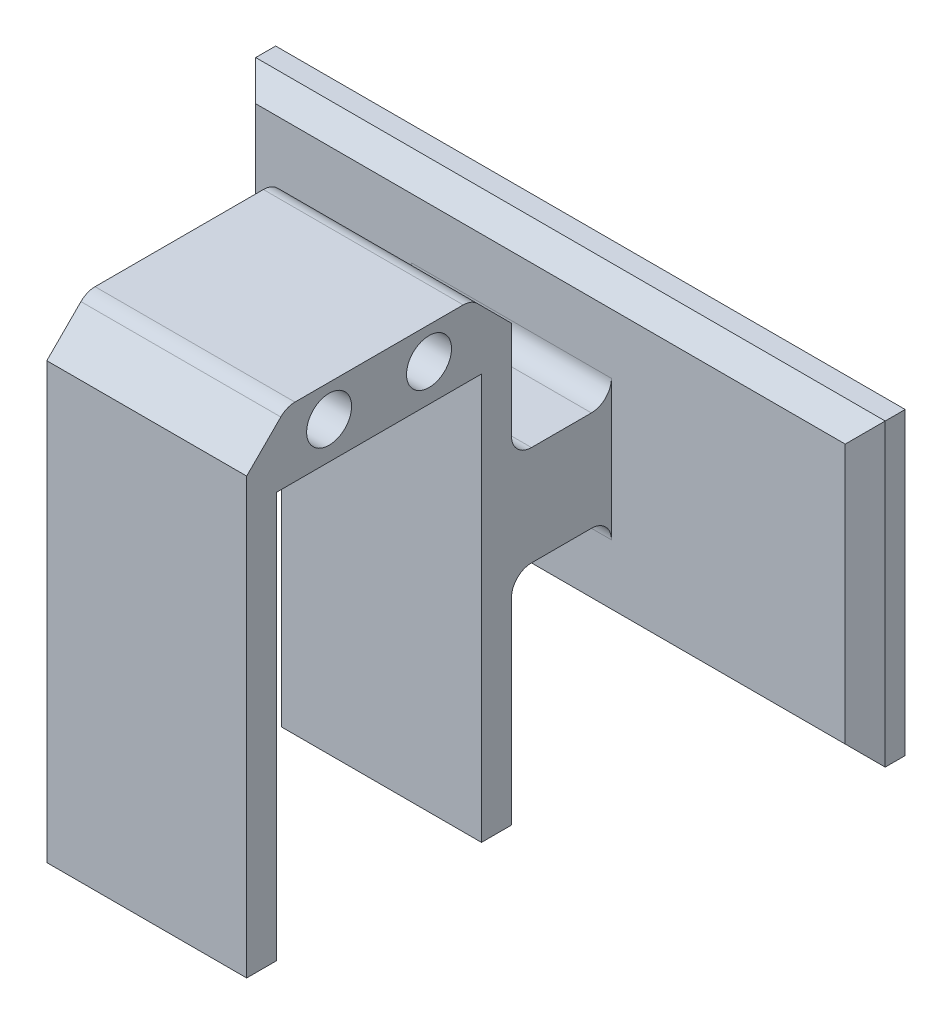
ISO-10303-21;
HEADER;
FILE_DESCRIPTION(('STEP AP214'),'2;1');
FILE_NAME('part.step','',(''),(''),'','','');
FILE_SCHEMA(('AUTOMOTIVE_DESIGN { 1 0 10303 214 1 1 1 1 }'));
ENDSEC;
DATA;
#1=APPLICATION_CONTEXT('core data for automotive mechanical design processes');
#2=APPLICATION_PROTOCOL_DEFINITION('international standard','automotive_design',2000,#1);
#3=PRODUCT_CONTEXT('',#1,'mechanical');
#4=PRODUCT('Part','Part','',(#3));
#5=PRODUCT_RELATED_PRODUCT_CATEGORY('part','',(#4));
#6=PRODUCT_DEFINITION_FORMATION('','',#4);
#7=PRODUCT_DEFINITION_CONTEXT('part definition',#1,'design');
#8=PRODUCT_DEFINITION('design','',#6,#7);
#9=PRODUCT_DEFINITION_SHAPE('','',#8);
#10=(LENGTH_UNIT() NAMED_UNIT(*) SI_UNIT(.MILLI.,.METRE.));
#11=(NAMED_UNIT(*) PLANE_ANGLE_UNIT() SI_UNIT($,.RADIAN.));
#12=(NAMED_UNIT(*) SI_UNIT($,.STERADIAN.) SOLID_ANGLE_UNIT());
#13=UNCERTAINTY_MEASURE_WITH_UNIT(LENGTH_MEASURE(1.E-05),#10,'distance_accuracy_value','');
#14=(GEOMETRIC_REPRESENTATION_CONTEXT(3) GLOBAL_UNCERTAINTY_ASSIGNED_CONTEXT((#13)) GLOBAL_UNIT_ASSIGNED_CONTEXT((#10,
#11,#12)) REPRESENTATION_CONTEXT('',''));
#15=CARTESIAN_POINT('',(0.,0.,0.));
#16=DIRECTION('',(0.,0.,1.));
#17=DIRECTION('',(1.,0.,0.));
#18=AXIS2_PLACEMENT_3D('',#15,#16,#17);
#19=CARTESIAN_POINT('',(20.,0.,-13.25));
#20=DIRECTION('',(0.,0.,1.));
#21=DIRECTION('',(0.,-1.,0.));
#22=AXIS2_PLACEMENT_3D('',#19,#20,#21);
#23=PLANE('',#22);
#24=DIRECTION('',(0.,1.,0.));
#25=VECTOR('',#24,1.);
#26=CARTESIAN_POINT('',(20.,0.,-13.25));
#27=LINE('',#26,#25);
#28=CARTESIAN_POINT('',(20.,13.423218072507,-13.25));
#29=VERTEX_POINT('',#28);
#30=CARTESIAN_POINT('',(20.,23.2,-13.25));
#31=VERTEX_POINT('',#30);
#32=EDGE_CURVE('E281',#29,#31,#27,.T.);
#33=ORIENTED_EDGE('',*,*,#32,.F.);
#34=DIRECTION('',(1.,0.,0.));
#35=VECTOR('',#34,1.);
#36=CARTESIAN_POINT('',(20.,13.423218072507,-13.25));
#37=LINE('',#36,#35);
#38=CARTESIAN_POINT('',(0.,13.423218072507,-13.25));
#39=VERTEX_POINT('',#38);
#40=EDGE_CURVE('E368',#29,#39,#37,.F.);
#41=ORIENTED_EDGE('',*,*,#40,.T.);
#42=DIRECTION('',(0.,1.,0.));
#43=VECTOR('',#42,1.);
#44=CARTESIAN_POINT('',(0.,0.,-13.25));
#45=LINE('',#44,#43);
#46=CARTESIAN_POINT('',(0.,23.2,-13.25));
#47=VERTEX_POINT('',#46);
#48=EDGE_CURVE('E301',#39,#47,#45,.T.);
#49=ORIENTED_EDGE('',*,*,#48,.T.);
#50=DIRECTION('',(1.,0.,0.));
#51=VECTOR('',#50,1.);
#52=CARTESIAN_POINT('',(20.,23.2,-13.25));
#53=LINE('',#52,#51);
#54=EDGE_CURVE('E331',#47,#31,#53,.T.);
#55=ORIENTED_EDGE('',*,*,#54,.T.);
#56=EDGE_LOOP('',(#33,#41,#49,#55));
#57=FACE_BOUND('',#56,.T.);
#58=ADVANCED_FACE('F42',(#57),#23,.F.);
#59=CARTESIAN_POINT('',(20.,24.,4.99999999999999));
#60=DIRECTION('',(-1.,0.,0.));
#61=DIRECTION('',(0.,0.,1.));
#62=AXIS2_PLACEMENT_3D('',#59,#60,#61);
#63=CYLINDRICAL_SURFACE('',#62,2.25);
#64=CARTESIAN_POINT('',(20.,24.,4.99999999999999));
#65=DIRECTION('',(1.,0.,0.));
#66=DIRECTION('',(0.,0.,-1.));
#67=AXIS2_PLACEMENT_3D('',#64,#65,#66);
#68=CIRCLE('',#67,2.25);
#69=CARTESIAN_POINT('',(20.,24.,2.74999999999999));
#70=VERTEX_POINT('',#69);
#71=EDGE_CURVE('E274',#70,#70,#68,.T.);
#72=ORIENTED_EDGE('',*,*,#71,.T.);
#73=EDGE_LOOP('',(#72));
#74=FACE_BOUND('',#73,.T.);
#75=CARTESIAN_POINT('',(10.,24.,4.99999999999999));
#76=DIRECTION('',(-1.,0.,0.));
#77=DIRECTION('',(0.,0.,1.));
#78=AXIS2_PLACEMENT_3D('',#75,#76,#77);
#79=CIRCLE('',#78,2.25);
#80=CARTESIAN_POINT('',(10.,24.,7.24999999999999));
#81=VERTEX_POINT('',#80);
#82=EDGE_CURVE('E262',#81,#81,#79,.T.);
#83=ORIENTED_EDGE('',*,*,#82,.T.);
#84=EDGE_LOOP('',(#83));
#85=FACE_BOUND('',#84,.T.);
#86=ADVANCED_FACE('F520',(#74,#85),#63,.F.);
#87=CARTESIAN_POINT('',(20.,24.,-5.00000000000001));
#88=DIRECTION('',(-1.,0.,0.));
#89=DIRECTION('',(0.,0.,1.));
#90=AXIS2_PLACEMENT_3D('',#87,#88,#89);
#91=CYLINDRICAL_SURFACE('',#90,2.25);
#92=CARTESIAN_POINT('',(20.,24.,-5.00000000000001));
#93=DIRECTION('',(1.,0.,0.));
#94=DIRECTION('',(0.,0.,-1.));
#95=AXIS2_PLACEMENT_3D('',#92,#93,#94);
#96=CIRCLE('',#95,2.25);
#97=CARTESIAN_POINT('',(20.,24.,-7.25000000000002));
#98=VERTEX_POINT('',#97);
#99=EDGE_CURVE('E271',#98,#98,#96,.T.);
#100=ORIENTED_EDGE('',*,*,#99,.T.);
#101=EDGE_LOOP('',(#100));
#102=FACE_BOUND('',#101,.T.);
#103=CARTESIAN_POINT('',(10.,24.,-5.00000000000001));
#104=DIRECTION('',(-1.,0.,0.));
#105=DIRECTION('',(0.,0.,1.));
#106=AXIS2_PLACEMENT_3D('',#103,#104,#105);
#107=CIRCLE('',#106,2.25);
#108=CARTESIAN_POINT('',(10.,24.,-2.75000000000001));
#109=VERTEX_POINT('',#108);
#110=EDGE_CURVE('E267',#109,#109,#107,.T.);
#111=ORIENTED_EDGE('',*,*,#110,.T.);
#112=EDGE_LOOP('',(#111));
#113=FACE_BOUND('',#112,.T.);
#114=ADVANCED_FACE('F525',(#102,#113),#91,.F.);
#115=CARTESIAN_POINT('',(20.,-20.3,0.));
#116=DIRECTION('',(0.,1.,0.));
#117=DIRECTION('',(0.,0.,1.));
#118=AXIS2_PLACEMENT_3D('',#115,#116,#117);
#119=PLANE('',#118);
#120=DIRECTION('',(0.,0.,-1.));
#121=VECTOR('',#120,1.);
#122=CARTESIAN_POINT('',(0.,-20.3,0.));
#123=LINE('',#122,#121);
#124=CARTESIAN_POINT('',(0.,-20.3,-10.25));
#125=VERTEX_POINT('',#124);
#126=CARTESIAN_POINT('',(0.,-20.3,-13.25));
#127=VERTEX_POINT('',#126);
#128=EDGE_CURVE('E270',#125,#127,#123,.T.);
#129=ORIENTED_EDGE('',*,*,#128,.T.);
#130=DIRECTION('',(-1.,0.,0.));
#131=VECTOR('',#130,1.);
#132=CARTESIAN_POINT('',(20.,-20.3,-13.25));
#133=LINE('',#132,#131);
#134=CARTESIAN_POINT('',(20.,-20.3,-13.25));
#135=VERTEX_POINT('',#134);
#136=EDGE_CURVE('E328',#135,#127,#133,.T.);
#137=ORIENTED_EDGE('',*,*,#136,.F.);
#138=DIRECTION('',(0.,0.,-1.));
#139=VECTOR('',#138,1.);
#140=CARTESIAN_POINT('',(20.,-20.3,0.));
#141=LINE('',#140,#139);
#142=CARTESIAN_POINT('',(20.,-20.3,-10.25));
#143=VERTEX_POINT('',#142);
#144=EDGE_CURVE('E278',#143,#135,#141,.T.);
#145=ORIENTED_EDGE('',*,*,#144,.F.);
#146=DIRECTION('',(-1.,0.,0.));
#147=VECTOR('',#146,1.);
#148=CARTESIAN_POINT('',(20.,-20.3,-10.25));
#149=LINE('',#148,#147);
#150=EDGE_CURVE('E298',#143,#125,#149,.T.);
#151=ORIENTED_EDGE('',*,*,#150,.T.);
#152=EDGE_LOOP('',(#129,#137,#145,#151));
#153=FACE_BOUND('',#152,.T.);
#154=ADVANCED_FACE('F499',(#153),#119,.F.);
#155=CARTESIAN_POINT('',(0.,-0.57678192749301,-13.25));
#156=VERTEX_POINT('',#155);
#157=EDGE_CURVE('E302',#127,#156,#45,.T.);
#158=ORIENTED_EDGE('',*,*,#157,.T.);
#159=DIRECTION('',(1.,0.,0.));
#160=VECTOR('',#159,1.);
#161=CARTESIAN_POINT('',(20.,-0.57678192749301,-13.25));
#162=LINE('',#161,#160);
#163=CARTESIAN_POINT('',(20.,-0.57678192749301,-13.25));
#164=VERTEX_POINT('',#163);
#165=EDGE_CURVE('E370',#156,#164,#162,.T.);
#166=ORIENTED_EDGE('',*,*,#165,.T.);
#167=EDGE_CURVE('E282',#135,#164,#27,.T.);
#168=ORIENTED_EDGE('',*,*,#167,.F.);
#169=ORIENTED_EDGE('',*,*,#136,.T.);
#170=EDGE_LOOP('',(#158,#166,#168,#169));
#171=FACE_BOUND('',#170,.T.);
#172=ADVANCED_FACE('F502',(#171),#23,.F.);
#173=CARTESIAN_POINT('',(20.,0.,13.25));
#174=DIRECTION('',(0.,0.,1.));
#175=DIRECTION('',(1.,0.,0.));
#176=AXIS2_PLACEMENT_3D('',#173,#174,#175);
#177=PLANE('',#176);
#178=DIRECTION('',(0.,1.,0.));
#179=VECTOR('',#178,1.);
#180=CARTESIAN_POINT('',(20.,0.,13.25));
#181=LINE('',#180,#179);
#182=CARTESIAN_POINT('',(20.,-20.3,13.25));
#183=VERTEX_POINT('',#182);
#184=CARTESIAN_POINT('',(20.,23.2,13.25));
#185=VERTEX_POINT('',#184);
#186=EDGE_CURVE('E285',#183,#185,#181,.T.);
#187=ORIENTED_EDGE('',*,*,#186,.T.);
#188=DIRECTION('',(-1.,0.,0.));
#189=VECTOR('',#188,1.);
#190=CARTESIAN_POINT('',(0.,23.2,13.25));
#191=LINE('',#190,#189);
#192=CARTESIAN_POINT('',(0.,23.2,13.25));
#193=VERTEX_POINT('',#192);
#194=EDGE_CURVE('E342',#185,#193,#191,.T.);
#195=ORIENTED_EDGE('',*,*,#194,.T.);
#196=DIRECTION('',(0.,1.,0.));
#197=VECTOR('',#196,1.);
#198=CARTESIAN_POINT('',(0.,0.,13.25));
#199=LINE('',#198,#197);
#200=CARTESIAN_POINT('',(0.,-20.3,13.25));
#201=VERTEX_POINT('',#200);
#202=EDGE_CURVE('E305',#201,#193,#199,.T.);
#203=ORIENTED_EDGE('',*,*,#202,.F.);
#204=DIRECTION('',(-1.,0.,0.));
#205=VECTOR('',#204,1.);
#206=CARTESIAN_POINT('',(20.,-20.3,13.25));
#207=LINE('',#206,#205);
#208=EDGE_CURVE('E326',#183,#201,#207,.T.);
#209=ORIENTED_EDGE('',*,*,#208,.F.);
#210=EDGE_LOOP('',(#187,#195,#203,#209));
#211=FACE_BOUND('',#210,.T.);
#212=ADVANCED_FACE('F477',(#211),#177,.T.);
#213=CARTESIAN_POINT('',(20.,-20.3,0.));
#214=DIRECTION('',(0.,-1.,0.));
#215=DIRECTION('',(0.,0.,-1.));
#216=AXIS2_PLACEMENT_3D('',#213,#214,#215);
#217=PLANE('',#216);
#218=DIRECTION('',(0.,0.,1.));
#219=VECTOR('',#218,1.);
#220=CARTESIAN_POINT('',(0.,-20.3,0.));
#221=LINE('',#220,#219);
#222=CARTESIAN_POINT('',(0.,-20.3,10.25));
#223=VERTEX_POINT('',#222);
#224=EDGE_CURVE('E308',#223,#201,#221,.T.);
#225=ORIENTED_EDGE('',*,*,#224,.F.);
#226=DIRECTION('',(-1.,0.,0.));
#227=VECTOR('',#226,1.);
#228=CARTESIAN_POINT('',(20.,-20.3,10.25));
#229=LINE('',#228,#227);
#230=CARTESIAN_POINT('',(20.,-20.3,10.25));
#231=VERTEX_POINT('',#230);
#232=EDGE_CURVE('E324',#231,#223,#229,.T.);
#233=ORIENTED_EDGE('',*,*,#232,.F.);
#234=DIRECTION('',(0.,0.,1.));
#235=VECTOR('',#234,1.);
#236=CARTESIAN_POINT('',(20.,-20.3,0.));
#237=LINE('',#236,#235);
#238=EDGE_CURVE('E288',#231,#183,#237,.T.);
#239=ORIENTED_EDGE('',*,*,#238,.T.);
#240=ORIENTED_EDGE('',*,*,#208,.T.);
#241=EDGE_LOOP('',(#225,#233,#239,#240));
#242=FACE_BOUND('',#241,.T.);
#243=ADVANCED_FACE('F482',(#242),#217,.T.);
#244=CARTESIAN_POINT('',(20.,0.,10.25));
#245=DIRECTION('',(0.,0.,1.));
#246=DIRECTION('',(1.,0.,0.));
#247=AXIS2_PLACEMENT_3D('',#244,#245,#246);
#248=PLANE('',#247);
#249=DIRECTION('',(0.,1.,0.));
#250=VECTOR('',#249,1.);
#251=CARTESIAN_POINT('',(0.,0.,10.25));
#252=LINE('',#251,#250);
#253=CARTESIAN_POINT('',(0.,20.3,10.25));
#254=VERTEX_POINT('',#253);
#255=EDGE_CURVE('E311',#223,#254,#252,.T.);
#256=ORIENTED_EDGE('',*,*,#255,.T.);
#257=DIRECTION('',(-1.,0.,0.));
#258=VECTOR('',#257,1.);
#259=CARTESIAN_POINT('',(20.,20.3,10.25));
#260=LINE('',#259,#258);
#261=CARTESIAN_POINT('',(20.,20.3,10.25));
#262=VERTEX_POINT('',#261);
#263=EDGE_CURVE('E321',#262,#254,#260,.T.);
#264=ORIENTED_EDGE('',*,*,#263,.F.);
#265=DIRECTION('',(0.,1.,0.));
#266=VECTOR('',#265,1.);
#267=CARTESIAN_POINT('',(20.,0.,10.25));
#268=LINE('',#267,#266);
#269=EDGE_CURVE('E291',#231,#262,#268,.T.);
#270=ORIENTED_EDGE('',*,*,#269,.F.);
#271=ORIENTED_EDGE('',*,*,#232,.T.);
#272=EDGE_LOOP('',(#256,#264,#270,#271));
#273=FACE_BOUND('',#272,.T.);
#274=ADVANCED_FACE('F490',(#273),#248,.F.);
#275=CARTESIAN_POINT('',(20.,20.3,0.));
#276=DIRECTION('',(0.,1.,0.));
#277=DIRECTION('',(0.,0.,1.));
#278=AXIS2_PLACEMENT_3D('',#275,#276,#277);
#279=PLANE('',#278);
#280=DIRECTION('',(0.,0.,-1.));
#281=VECTOR('',#280,1.);
#282=CARTESIAN_POINT('',(0.,20.3,0.));
#283=LINE('',#282,#281);
#284=CARTESIAN_POINT('',(0.,20.3,-10.25));
#285=VERTEX_POINT('',#284);
#286=EDGE_CURVE('E313',#254,#285,#283,.T.);
#287=ORIENTED_EDGE('',*,*,#286,.T.);
#288=DIRECTION('',(-1.,0.,0.));
#289=VECTOR('',#288,1.);
#290=CARTESIAN_POINT('',(20.,20.3,-10.25));
#291=LINE('',#290,#289);
#292=CARTESIAN_POINT('',(20.,20.3,-10.25));
#293=VERTEX_POINT('',#292);
#294=EDGE_CURVE('E319',#293,#285,#291,.T.);
#295=ORIENTED_EDGE('',*,*,#294,.F.);
#296=DIRECTION('',(0.,0.,-1.));
#297=VECTOR('',#296,1.);
#298=CARTESIAN_POINT('',(20.,20.3,0.));
#299=LINE('',#298,#297);
#300=EDGE_CURVE('E293',#262,#293,#299,.T.);
#301=ORIENTED_EDGE('',*,*,#300,.F.);
#302=ORIENTED_EDGE('',*,*,#263,.T.);
#303=EDGE_LOOP('',(#287,#295,#301,#302));
#304=FACE_BOUND('',#303,.T.);
#305=ADVANCED_FACE('F492',(#304),#279,.F.);
#306=CARTESIAN_POINT('',(20.,0.,-10.25));
#307=DIRECTION('',(0.,0.,1.));
#308=DIRECTION('',(1.,0.,0.));
#309=AXIS2_PLACEMENT_3D('',#306,#307,#308);
#310=PLANE('',#309);
#311=DIRECTION('',(0.,1.,0.));
#312=VECTOR('',#311,1.);
#313=CARTESIAN_POINT('',(0.,0.,-10.25));
#314=LINE('',#313,#312);
#315=EDGE_CURVE('E275',#125,#285,#314,.T.);
#316=ORIENTED_EDGE('',*,*,#315,.F.);
#317=ORIENTED_EDGE('',*,*,#150,.F.);
#318=DIRECTION('',(0.,1.,0.));
#319=VECTOR('',#318,1.);
#320=CARTESIAN_POINT('',(20.,0.,-10.25));
#321=LINE('',#320,#319);
#322=EDGE_CURVE('E295',#143,#293,#321,.T.);
#323=ORIENTED_EDGE('',*,*,#322,.T.);
#324=ORIENTED_EDGE('',*,*,#294,.T.);
#325=EDGE_LOOP('',(#316,#317,#323,#324));
#326=FACE_BOUND('',#325,.T.);
#327=ADVANCED_FACE('F495',(#326),#310,.T.);
#328=CARTESIAN_POINT('',(20.,0.,0.));
#329=DIRECTION('',(1.,0.,0.));
#330=DIRECTION('',(0.,0.,-1.));
#331=AXIS2_PLACEMENT_3D('',#328,#329,#330);
#332=PLANE('',#331);
#333=DIRECTION('',(0.,-0.707106781186546,-0.707106781186549));
#334=VECTOR('',#333,1.);
#335=CARTESIAN_POINT('',(20.,18.2250000000001,-18.225));
#336=LINE('',#335,#334);
#337=CARTESIAN_POINT('',(20.,26.6142135623731,-9.83578643762689));
#338=VERTEX_POINT('',#337);
#339=EDGE_CURVE('E334',#31,#338,#336,.F.);
#340=ORIENTED_EDGE('',*,*,#339,.T.);
#341=CARTESIAN_POINT('',(20.,25.2,-8.4215728752538));
#342=DIRECTION('',(1.,0.,0.));
#343=DIRECTION('',(0.,0.,-1.));
#344=AXIS2_PLACEMENT_3D('',#341,#342,#343);
#345=CIRCLE('',#344,2.);
#346=CARTESIAN_POINT('',(20.,27.2,-8.4215728752538));
#347=VERTEX_POINT('',#346);
#348=EDGE_CURVE('E361',#338,#347,#345,.T.);
#349=ORIENTED_EDGE('',*,*,#348,.T.);
#350=DIRECTION('',(0.,0.,-1.));
#351=VECTOR('',#350,1.);
#352=CARTESIAN_POINT('',(20.,27.2,13.25));
#353=LINE('',#352,#351);
#354=CARTESIAN_POINT('',(20.,27.2,8.42157287525382));
#355=VERTEX_POINT('',#354);
#356=EDGE_CURVE('E258',#355,#347,#353,.T.);
#357=ORIENTED_EDGE('',*,*,#356,.F.);
#358=CARTESIAN_POINT('',(20.,25.2,8.42157287525382));
#359=DIRECTION('',(1.,0.,0.));
#360=DIRECTION('',(0.,0.,-1.));
#361=AXIS2_PLACEMENT_3D('',#358,#359,#360);
#362=CIRCLE('',#361,2.);
#363=CARTESIAN_POINT('',(20.,26.6142135623731,9.83578643762692));
#364=VERTEX_POINT('',#363);
#365=EDGE_CURVE('E359',#355,#364,#362,.T.);
#366=ORIENTED_EDGE('',*,*,#365,.T.);
#367=DIRECTION('',(0.,-0.707106781186549,0.707106781186546));
#368=VECTOR('',#367,1.);
#369=CARTESIAN_POINT('',(20.,18.225,18.225));
#370=LINE('',#369,#368);
#371=EDGE_CURVE('E340',#364,#185,#370,.T.);
#372=ORIENTED_EDGE('',*,*,#371,.T.);
#373=ORIENTED_EDGE('',*,*,#186,.F.);
#374=ORIENTED_EDGE('',*,*,#238,.F.);
#375=ORIENTED_EDGE('',*,*,#269,.T.);
#376=ORIENTED_EDGE('',*,*,#300,.T.);
#377=ORIENTED_EDGE('',*,*,#322,.F.);
#378=ORIENTED_EDGE('',*,*,#144,.T.);
#379=ORIENTED_EDGE('',*,*,#167,.T.);
#380=CARTESIAN_POINT('',(20.,-0.57678192749301,-15.25));
#381=DIRECTION('',(1.,0.,0.));
#382=DIRECTION('',(0.,0.,-1.));
#383=AXIS2_PLACEMENT_3D('',#380,#381,#382);
#384=CIRCLE('',#383,2.);
#385=CARTESIAN_POINT('',(20.,1.42321807250699,-15.25));
#386=VERTEX_POINT('',#385);
#387=EDGE_CURVE('E380',#164,#386,#384,.F.);
#388=ORIENTED_EDGE('',*,*,#387,.T.);
#389=DIRECTION('',(0.,0.,-1.));
#390=VECTOR('',#389,1.);
#391=CARTESIAN_POINT('',(20.,1.42321807250699,-23.25));
#392=LINE('',#391,#390);
#393=CARTESIAN_POINT('',(20.,1.42321807250699,-21.25));
#394=VERTEX_POINT('',#393);
#395=EDGE_CURVE('E250',#386,#394,#392,.T.);
#396=ORIENTED_EDGE('',*,*,#395,.T.);
#397=CARTESIAN_POINT('',(20.,-0.57678192749301,-21.25));
#398=DIRECTION('',(1.,0.,0.));
#399=DIRECTION('',(0.,0.,-1.));
#400=AXIS2_PLACEMENT_3D('',#397,#398,#399);
#401=CIRCLE('',#400,2.);
#402=CARTESIAN_POINT('',(20.,-0.57678192749301,-23.25));
#403=VERTEX_POINT('',#402);
#404=EDGE_CURVE('E50',#394,#403,#401,.F.);
#405=ORIENTED_EDGE('',*,*,#404,.T.);
#406=DIRECTION('',(0.,1.,0.));
#407=VECTOR('',#406,1.);
#408=CARTESIAN_POINT('',(20.,11.423218072507,-23.25));
#409=LINE('',#408,#407);
#410=CARTESIAN_POINT('',(20.,13.423218072507,-23.25));
#411=VERTEX_POINT('',#410);
#412=EDGE_CURVE('E239',#403,#411,#409,.T.);
#413=ORIENTED_EDGE('',*,*,#412,.T.);
#414=CARTESIAN_POINT('',(20.,13.423218072507,-21.25));
#415=DIRECTION('',(1.,0.,0.));
#416=DIRECTION('',(0.,0.,-1.));
#417=AXIS2_PLACEMENT_3D('',#414,#415,#416);
#418=CIRCLE('',#417,2.);
#419=CARTESIAN_POINT('',(20.,11.423218072507,-21.25));
#420=VERTEX_POINT('',#419);
#421=EDGE_CURVE('E420',#411,#420,#418,.F.);
#422=ORIENTED_EDGE('',*,*,#421,.T.);
#423=DIRECTION('',(0.,0.,1.));
#424=VECTOR('',#423,1.);
#425=CARTESIAN_POINT('',(20.,11.423218072507,-13.25));
#426=LINE('',#425,#424);
#427=CARTESIAN_POINT('',(20.,11.423218072507,-15.25));
#428=VERTEX_POINT('',#427);
#429=EDGE_CURVE('E241',#420,#428,#426,.T.);
#430=ORIENTED_EDGE('',*,*,#429,.T.);
#431=CARTESIAN_POINT('',(20.,13.423218072507,-15.25));
#432=DIRECTION('',(1.,0.,0.));
#433=DIRECTION('',(0.,0.,-1.));
#434=AXIS2_PLACEMENT_3D('',#431,#432,#433);
#435=CIRCLE('',#434,2.);
#436=EDGE_CURVE('E376',#428,#29,#435,.F.);
#437=ORIENTED_EDGE('',*,*,#436,.T.);
#438=ORIENTED_EDGE('',*,*,#32,.T.);
#439=EDGE_LOOP('',(#340,#349,#357,#366,#372,#373,#374,#375,#376,#377,#378,#379,#388,#396,#405,
#413,#422,#430,#437,#438));
#440=FACE_BOUND('',#439,.T.);
#441=ORIENTED_EDGE('',*,*,#99,.F.);
#442=EDGE_LOOP('',(#441));
#443=FACE_BOUND('',#442,.T.);
#444=ORIENTED_EDGE('',*,*,#71,.F.);
#445=EDGE_LOOP('',(#444));
#446=FACE_BOUND('',#445,.T.);
#447=ADVANCED_FACE('F425',(#440,#443,#446),#332,.T.);
#448=CARTESIAN_POINT('',(0.,0.,0.));
#449=DIRECTION('',(1.,0.,0.));
#450=DIRECTION('',(0.,0.,-1.));
#451=AXIS2_PLACEMENT_3D('',#448,#449,#450);
#452=PLANE('',#451);
#453=DIRECTION('',(0.,0.,-1.));
#454=VECTOR('',#453,1.);
#455=CARTESIAN_POINT('',(0.,27.2,13.25));
#456=LINE('',#455,#454);
#457=CARTESIAN_POINT('',(0.,27.2,8.42157287525382));
#458=VERTEX_POINT('',#457);
#459=CARTESIAN_POINT('',(0.,27.2,-8.4215728752538));
#460=VERTEX_POINT('',#459);
#461=EDGE_CURVE('E259',#458,#460,#456,.T.);
#462=ORIENTED_EDGE('',*,*,#461,.T.);
#463=CARTESIAN_POINT('',(0.,25.2,-8.4215728752538));
#464=DIRECTION('',(1.,0.,0.));
#465=DIRECTION('',(0.,0.,-1.));
#466=AXIS2_PLACEMENT_3D('',#463,#464,#465);
#467=CIRCLE('',#466,2.);
#468=CARTESIAN_POINT('',(0.,26.6142135623731,-9.83578643762689));
#469=VERTEX_POINT('',#468);
#470=EDGE_CURVE('E355',#460,#469,#467,.F.);
#471=ORIENTED_EDGE('',*,*,#470,.T.);
#472=DIRECTION('',(0.,0.707106781186546,0.707106781186549));
#473=VECTOR('',#472,1.);
#474=CARTESIAN_POINT('',(0.,23.2,-13.25));
#475=LINE('',#474,#473);
#476=EDGE_CURVE('E337',#469,#47,#475,.F.);
#477=ORIENTED_EDGE('',*,*,#476,.T.);
#478=ORIENTED_EDGE('',*,*,#48,.F.);
#479=CARTESIAN_POINT('',(0.,13.423218072507,-15.25));
#480=DIRECTION('',(1.,0.,0.));
#481=DIRECTION('',(0.,0.,-1.));
#482=AXIS2_PLACEMENT_3D('',#479,#480,#481);
#483=CIRCLE('',#482,2.);
#484=CARTESIAN_POINT('',(0.,11.423218072507,-15.25));
#485=VERTEX_POINT('',#484);
#486=EDGE_CURVE('E378',#39,#485,#483,.T.);
#487=ORIENTED_EDGE('',*,*,#486,.T.);
#488=DIRECTION('',(0.,0.,-1.));
#489=VECTOR('',#488,1.);
#490=CARTESIAN_POINT('',(0.,11.423218072507,-13.25));
#491=LINE('',#490,#489);
#492=CARTESIAN_POINT('',(0.,11.423218072507,-21.25));
#493=VERTEX_POINT('',#492);
#494=EDGE_CURVE('E251',#485,#493,#491,.T.);
#495=ORIENTED_EDGE('',*,*,#494,.T.);
#496=CARTESIAN_POINT('',(0.,13.423218072507,-21.25));
#497=DIRECTION('',(1.,0.,0.));
#498=DIRECTION('',(0.,0.,-1.));
#499=AXIS2_PLACEMENT_3D('',#496,#497,#498);
#500=CIRCLE('',#499,2.);
#501=CARTESIAN_POINT('',(0.,13.423218072507,-23.25));
#502=VERTEX_POINT('',#501);
#503=EDGE_CURVE('E422',#493,#502,#500,.T.);
#504=ORIENTED_EDGE('',*,*,#503,.T.);
#505=DIRECTION('',(0.,-1.,0.));
#506=VECTOR('',#505,1.);
#507=CARTESIAN_POINT('',(0.,11.423218072507,-23.25));
#508=LINE('',#507,#506);
#509=CARTESIAN_POINT('',(0.,-0.57678192749301,-23.25));
#510=VERTEX_POINT('',#509);
#511=EDGE_CURVE('E249',#502,#510,#508,.T.);
#512=ORIENTED_EDGE('',*,*,#511,.T.);
#513=CARTESIAN_POINT('',(0.,-0.57678192749301,-21.25));
#514=DIRECTION('',(1.,0.,0.));
#515=DIRECTION('',(0.,0.,-1.));
#516=AXIS2_PLACEMENT_3D('',#513,#514,#515);
#517=CIRCLE('',#516,2.);
#518=CARTESIAN_POINT('',(0.,1.42321807250699,-21.25));
#519=VERTEX_POINT('',#518);
#520=EDGE_CURVE('E11',#510,#519,#517,.T.);
#521=ORIENTED_EDGE('',*,*,#520,.T.);
#522=DIRECTION('',(0.,0.,1.));
#523=VECTOR('',#522,1.);
#524=CARTESIAN_POINT('',(0.,1.42321807250699,-23.25));
#525=LINE('',#524,#523);
#526=CARTESIAN_POINT('',(0.,1.42321807250699,-15.25));
#527=VERTEX_POINT('',#526);
#528=EDGE_CURVE('E247',#519,#527,#525,.T.);
#529=ORIENTED_EDGE('',*,*,#528,.T.);
#530=CARTESIAN_POINT('',(0.,-0.57678192749301,-15.25));
#531=DIRECTION('',(1.,0.,0.));
#532=DIRECTION('',(0.,0.,-1.));
#533=AXIS2_PLACEMENT_3D('',#530,#531,#532);
#534=CIRCLE('',#533,2.);
#535=EDGE_CURVE('E382',#527,#156,#534,.T.);
#536=ORIENTED_EDGE('',*,*,#535,.T.);
#537=ORIENTED_EDGE('',*,*,#157,.F.);
#538=ORIENTED_EDGE('',*,*,#128,.F.);
#539=ORIENTED_EDGE('',*,*,#315,.T.);
#540=ORIENTED_EDGE('',*,*,#286,.F.);
#541=ORIENTED_EDGE('',*,*,#255,.F.);
#542=ORIENTED_EDGE('',*,*,#224,.T.);
#543=ORIENTED_EDGE('',*,*,#202,.T.);
#544=DIRECTION('',(0.,0.707106781186549,-0.707106781186546));
#545=VECTOR('',#544,1.);
#546=CARTESIAN_POINT('',(0.,27.2,9.25000000000001));
#547=LINE('',#546,#545);
#548=CARTESIAN_POINT('',(0.,26.6142135623731,9.83578643762692));
#549=VERTEX_POINT('',#548);
#550=EDGE_CURVE('E344',#193,#549,#547,.T.);
#551=ORIENTED_EDGE('',*,*,#550,.T.);
#552=CARTESIAN_POINT('',(0.,25.2,8.42157287525382));
#553=DIRECTION('',(1.,0.,0.));
#554=DIRECTION('',(0.,0.,-1.));
#555=AXIS2_PLACEMENT_3D('',#552,#553,#554);
#556=CIRCLE('',#555,2.);
#557=EDGE_CURVE('E353',#549,#458,#556,.F.);
#558=ORIENTED_EDGE('',*,*,#557,.T.);
#559=EDGE_LOOP('',(#462,#471,#477,#478,#487,#495,#504,#512,#521,#529,#536,#537,#538,#539,#540,
#541,#542,#543,#551,#558));
#560=FACE_BOUND('',#559,.T.);
#561=ADVANCED_FACE('F464',(#560),#452,.F.);
#562=CARTESIAN_POINT('',(10.,24.,-5.00000000000001));
#563=DIRECTION('',(-1.,0.,0.));
#564=DIRECTION('',(0.,0.,1.));
#565=AXIS2_PLACEMENT_3D('',#562,#563,#564);
#566=PLANE('',#565);
#567=ORIENTED_EDGE('',*,*,#110,.F.);
#568=EDGE_LOOP('',(#567));
#569=FACE_BOUND('',#568,.T.);
#570=ADVANCED_FACE('F739',(#569),#566,.F.);
#571=CARTESIAN_POINT('',(10.,24.,4.99999999999999));
#572=DIRECTION('',(-1.,0.,0.));
#573=DIRECTION('',(0.,0.,1.));
#574=AXIS2_PLACEMENT_3D('',#571,#572,#573);
#575=PLANE('',#574);
#576=ORIENTED_EDGE('',*,*,#82,.F.);
#577=EDGE_LOOP('',(#576));
#578=FACE_BOUND('',#577,.T.);
#579=ADVANCED_FACE('F729',(#578),#575,.F.);
#580=CARTESIAN_POINT('',(0.,27.2,13.25));
#581=DIRECTION('',(0.,-1.,0.));
#582=DIRECTION('',(0.,0.,-1.));
#583=AXIS2_PLACEMENT_3D('',#580,#581,#582);
#584=PLANE('',#583);
#585=ORIENTED_EDGE('',*,*,#356,.T.);
#586=DIRECTION('',(1.,0.,0.));
#587=VECTOR('',#586,1.);
#588=CARTESIAN_POINT('',(0.,27.2,-8.4215728752538));
#589=LINE('',#588,#587);
#590=EDGE_CURVE('E350',#347,#460,#589,.F.);
#591=ORIENTED_EDGE('',*,*,#590,.T.);
#592=ORIENTED_EDGE('',*,*,#461,.F.);
#593=DIRECTION('',(1.,0.,0.));
#594=VECTOR('',#593,1.);
#595=CARTESIAN_POINT('',(20.,27.2,8.42157287525382));
#596=LINE('',#595,#594);
#597=EDGE_CURVE('E347',#458,#355,#596,.T.);
#598=ORIENTED_EDGE('',*,*,#597,.T.);
#599=EDGE_LOOP('',(#585,#591,#592,#598));
#600=FACE_BOUND('',#599,.T.);
#601=ADVANCED_FACE('F462',(#600),#584,.F.);
#602=CARTESIAN_POINT('',(20.,23.2,-13.25));
#603=DIRECTION('',(0.,-0.707106781186549,0.707106781186546));
#604=DIRECTION('',(1.,0.,0.));
#605=AXIS2_PLACEMENT_3D('',#602,#603,#604);
#606=PLANE('',#605);
#607=ORIENTED_EDGE('',*,*,#476,.F.);
#608=DIRECTION('',(-1.,0.,0.));
#609=VECTOR('',#608,1.);
#610=CARTESIAN_POINT('',(20.,26.6142135623731,-9.83578643762689));
#611=LINE('',#610,#609);
#612=EDGE_CURVE('E357',#469,#338,#611,.F.);
#613=ORIENTED_EDGE('',*,*,#612,.T.);
#614=ORIENTED_EDGE('',*,*,#339,.F.);
#615=ORIENTED_EDGE('',*,*,#54,.F.);
#616=EDGE_LOOP('',(#607,#613,#614,#615));
#617=FACE_BOUND('',#616,.T.);
#618=ADVANCED_FACE('F453',(#617),#606,.F.);
#619=CARTESIAN_POINT('',(0.,27.2,9.25000000000001));
#620=DIRECTION('',(0.,0.707106781186546,0.707106781186549));
#621=DIRECTION('',(-1.,0.,0.));
#622=AXIS2_PLACEMENT_3D('',#619,#620,#621);
#623=PLANE('',#622);
#624=ORIENTED_EDGE('',*,*,#371,.F.);
#625=DIRECTION('',(1.,0.,0.));
#626=VECTOR('',#625,1.);
#627=CARTESIAN_POINT('',(0.,26.6142135623731,9.83578643762692));
#628=LINE('',#627,#626);
#629=EDGE_CURVE('E363',#364,#549,#628,.F.);
#630=ORIENTED_EDGE('',*,*,#629,.T.);
#631=ORIENTED_EDGE('',*,*,#550,.F.);
#632=ORIENTED_EDGE('',*,*,#194,.F.);
#633=EDGE_LOOP('',(#624,#630,#631,#632));
#634=FACE_BOUND('',#633,.T.);
#635=ADVANCED_FACE('F474',(#634),#623,.T.);
#636=CARTESIAN_POINT('',(0.,25.2,-8.4215728752538));
#637=DIRECTION('',(-1.,0.,0.));
#638=DIRECTION('',(0.,0.,1.));
#639=AXIS2_PLACEMENT_3D('',#636,#637,#638);
#640=CYLINDRICAL_SURFACE('',#639,2.);
#641=ORIENTED_EDGE('',*,*,#348,.F.);
#642=ORIENTED_EDGE('',*,*,#612,.F.);
#643=ORIENTED_EDGE('',*,*,#470,.F.);
#644=ORIENTED_EDGE('',*,*,#590,.F.);
#645=EDGE_LOOP('',(#641,#642,#643,#644));
#646=FACE_BOUND('',#645,.T.);
#647=ADVANCED_FACE('F459',(#646),#640,.T.);
#648=CARTESIAN_POINT('',(0.,25.2,8.42157287525382));
#649=DIRECTION('',(-1.,0.,0.));
#650=DIRECTION('',(0.,0.,1.));
#651=AXIS2_PLACEMENT_3D('',#648,#649,#650);
#652=CYLINDRICAL_SURFACE('',#651,2.);
#653=ORIENTED_EDGE('',*,*,#557,.F.);
#654=ORIENTED_EDGE('',*,*,#629,.F.);
#655=ORIENTED_EDGE('',*,*,#365,.F.);
#656=ORIENTED_EDGE('',*,*,#597,.F.);
#657=EDGE_LOOP('',(#653,#654,#655,#656));
#658=FACE_BOUND('',#657,.T.);
#659=ADVANCED_FACE('F469',(#658),#652,.T.);
#660=CARTESIAN_POINT('',(-14.142135623731,1.42321807250699,-23.25));
#661=DIRECTION('',(0.,-1.,0.));
#662=DIRECTION('',(0.,0.,-1.));
#663=AXIS2_PLACEMENT_3D('',#660,#661,#662);
#664=PLANE('',#663);
#665=ORIENTED_EDGE('',*,*,#528,.F.);
#666=DIRECTION('',(1.,0.,0.));
#667=VECTOR('',#666,1.);
#668=CARTESIAN_POINT('',(-14.142135623731,1.42321807250699,-21.25));
#669=LINE('',#668,#667);
#670=EDGE_CURVE('E418',#519,#394,#669,.T.);
#671=ORIENTED_EDGE('',*,*,#670,.T.);
#672=ORIENTED_EDGE('',*,*,#395,.F.);
#673=DIRECTION('',(1.,0.,0.));
#674=VECTOR('',#673,1.);
#675=CARTESIAN_POINT('',(-14.142135623731,1.42321807250699,-15.25));
#676=LINE('',#675,#674);
#677=EDGE_CURVE('E373',#386,#527,#676,.F.);
#678=ORIENTED_EDGE('',*,*,#677,.T.);
#679=EDGE_LOOP('',(#665,#671,#672,#678));
#680=FACE_BOUND('',#679,.T.);
#681=ADVANCED_FACE('F509',(#680),#664,.T.);
#682=CARTESIAN_POINT('',(-14.142135623731,11.423218072507,-13.25));
#683=DIRECTION('',(0.,1.,0.));
#684=DIRECTION('',(0.,0.,1.));
#685=AXIS2_PLACEMENT_3D('',#682,#683,#684);
#686=PLANE('',#685);
#687=ORIENTED_EDGE('',*,*,#429,.F.);
#688=DIRECTION('',(1.,0.,0.));
#689=VECTOR('',#688,1.);
#690=CARTESIAN_POINT('',(-14.142135623731,11.423218072507,-21.25));
#691=LINE('',#690,#689);
#692=EDGE_CURVE('E416',#420,#493,#691,.F.);
#693=ORIENTED_EDGE('',*,*,#692,.T.);
#694=ORIENTED_EDGE('',*,*,#494,.F.);
#695=DIRECTION('',(1.,0.,0.));
#696=VECTOR('',#695,1.);
#697=CARTESIAN_POINT('',(-14.142135623731,11.423218072507,-15.25));
#698=LINE('',#697,#696);
#699=EDGE_CURVE('E365',#485,#428,#698,.T.);
#700=ORIENTED_EDGE('',*,*,#699,.T.);
#701=EDGE_LOOP('',(#687,#693,#694,#700));
#702=FACE_BOUND('',#701,.T.);
#703=ADVANCED_FACE('F439',(#702),#686,.T.);
#704=CARTESIAN_POINT('',(-14.142135623731,13.423218072507,-15.25));
#705=DIRECTION('',(1.,0.,0.));
#706=DIRECTION('',(0.,0.,-1.));
#707=AXIS2_PLACEMENT_3D('',#704,#705,#706);
#708=CYLINDRICAL_SURFACE('',#707,2.);
#709=ORIENTED_EDGE('',*,*,#486,.F.);
#710=ORIENTED_EDGE('',*,*,#40,.F.);
#711=ORIENTED_EDGE('',*,*,#436,.F.);
#712=ORIENTED_EDGE('',*,*,#699,.F.);
#713=EDGE_LOOP('',(#709,#710,#711,#712));
#714=FACE_BOUND('',#713,.T.);
#715=ADVANCED_FACE('F444',(#714),#708,.F.);
#716=CARTESIAN_POINT('',(20.,-0.57678192749301,-15.25));
#717=DIRECTION('',(1.,0.,0.));
#718=DIRECTION('',(0.,0.,-1.));
#719=AXIS2_PLACEMENT_3D('',#716,#717,#718);
#720=CYLINDRICAL_SURFACE('',#719,2.);
#721=ORIENTED_EDGE('',*,*,#535,.F.);
#722=ORIENTED_EDGE('',*,*,#677,.F.);
#723=ORIENTED_EDGE('',*,*,#387,.F.);
#724=ORIENTED_EDGE('',*,*,#165,.F.);
#725=EDGE_LOOP('',(#721,#722,#723,#724));
#726=FACE_BOUND('',#725,.T.);
#727=ADVANCED_FACE('F506',(#726),#720,.F.);
#728=CARTESIAN_POINT('',(45.4,21.423218072507,-27.25));
#729=DIRECTION('',(-1.,0.,0.));
#730=DIRECTION('',(0.,0.,1.));
#731=AXIS2_PLACEMENT_3D('',#728,#729,#730);
#732=PLANE('',#731);
#733=DIRECTION('',(0.,0.,1.));
#734=VECTOR('',#733,1.);
#735=CARTESIAN_POINT('',(45.4,21.423218072507,-27.25));
#736=LINE('',#735,#734);
#737=CARTESIAN_POINT('',(45.4,21.423218072507,-27.25));
#738=VERTEX_POINT('',#737);
#739=CARTESIAN_POINT('',(45.4,21.423218072507,-25.25));
#740=VERTEX_POINT('',#739);
#741=EDGE_CURVE('E993',#738,#740,#736,.T.);
#742=ORIENTED_EDGE('',*,*,#741,.T.);
#743=DIRECTION('',(0.,-1.,0.));
#744=VECTOR('',#743,1.);
#745=CARTESIAN_POINT('',(45.4,21.423218072507,-25.25));
#746=LINE('',#745,#744);
#747=CARTESIAN_POINT('',(45.4,-8.57678192749301,-25.25));
#748=VERTEX_POINT('',#747);
#749=EDGE_CURVE('E238',#740,#748,#746,.T.);
#750=ORIENTED_EDGE('',*,*,#749,.T.);
#751=DIRECTION('',(0.,0.,1.));
#752=VECTOR('',#751,1.);
#753=CARTESIAN_POINT('',(45.4,-8.57678192749301,-27.25));
#754=LINE('',#753,#752);
#755=CARTESIAN_POINT('',(45.4,-8.57678192749301,-27.25));
#756=VERTEX_POINT('',#755);
#757=EDGE_CURVE('E218',#756,#748,#754,.T.);
#758=ORIENTED_EDGE('',*,*,#757,.F.);
#759=DIRECTION('',(0.,-1.,0.));
#760=VECTOR('',#759,1.);
#761=CARTESIAN_POINT('',(45.4,21.423218072507,-27.25));
#762=LINE('',#761,#760);
#763=EDGE_CURVE('E225',#738,#756,#762,.T.);
#764=ORIENTED_EDGE('',*,*,#763,.F.);
#765=EDGE_LOOP('',(#742,#750,#758,#764));
#766=FACE_BOUND('',#765,.T.);
#767=ADVANCED_FACE('F236',(#766),#732,.F.);
#768=CARTESIAN_POINT('',(45.4,-8.57678192749301,-27.25));
#769=DIRECTION('',(0.,1.,0.));
#770=DIRECTION('',(-1.,0.,0.));
#771=AXIS2_PLACEMENT_3D('',#768,#769,#770);
#772=PLANE('',#771);
#773=ORIENTED_EDGE('',*,*,#757,.T.);
#774=DIRECTION('',(-1.,0.,0.));
#775=VECTOR('',#774,1.);
#776=CARTESIAN_POINT('',(45.4,-8.57678192749301,-25.25));
#777=LINE('',#776,#775);
#778=CARTESIAN_POINT('',(-17.6,-8.57678192749301,-25.25));
#779=VERTEX_POINT('',#778);
#780=EDGE_CURVE('E396',#748,#779,#777,.T.);
#781=ORIENTED_EDGE('',*,*,#780,.T.);
#782=DIRECTION('',(0.,0.,1.));
#783=VECTOR('',#782,1.);
#784=CARTESIAN_POINT('',(-17.6,-8.57678192749301,-27.25));
#785=LINE('',#784,#783);
#786=CARTESIAN_POINT('',(-17.6,-8.57678192749301,-27.25));
#787=VERTEX_POINT('',#786);
#788=EDGE_CURVE('E221',#787,#779,#785,.T.);
#789=ORIENTED_EDGE('',*,*,#788,.F.);
#790=DIRECTION('',(-1.,0.,0.));
#791=VECTOR('',#790,1.);
#792=CARTESIAN_POINT('',(45.4,-8.57678192749301,-27.25));
#793=LINE('',#792,#791);
#794=EDGE_CURVE('E214',#756,#787,#793,.T.);
#795=ORIENTED_EDGE('',*,*,#794,.F.);
#796=EDGE_LOOP('',(#773,#781,#789,#795));
#797=FACE_BOUND('',#796,.T.);
#798=ADVANCED_FACE('F216',(#797),#772,.F.);
#799=CARTESIAN_POINT('',(-17.6,21.423218072507,-27.25));
#800=DIRECTION('',(1.,0.,0.));
#801=DIRECTION('',(0.,0.,-1.));
#802=AXIS2_PLACEMENT_3D('',#799,#800,#801);
#803=PLANE('',#802);
#804=ORIENTED_EDGE('',*,*,#788,.T.);
#805=DIRECTION('',(0.,1.,0.));
#806=VECTOR('',#805,1.);
#807=CARTESIAN_POINT('',(-17.6,21.423218072507,-25.25));
#808=LINE('',#807,#806);
#809=CARTESIAN_POINT('',(-17.6,21.423218072507,-25.25));
#810=VERTEX_POINT('',#809);
#811=EDGE_CURVE('E384',#779,#810,#808,.T.);
#812=ORIENTED_EDGE('',*,*,#811,.T.);
#813=DIRECTION('',(0.,0.,1.));
#814=VECTOR('',#813,1.);
#815=CARTESIAN_POINT('',(-17.6,21.423218072507,-27.25));
#816=LINE('',#815,#814);
#817=CARTESIAN_POINT('',(-17.6,21.423218072507,-27.25));
#818=VERTEX_POINT('',#817);
#819=EDGE_CURVE('E243',#818,#810,#816,.T.);
#820=ORIENTED_EDGE('',*,*,#819,.F.);
#821=DIRECTION('',(0.,1.,0.));
#822=VECTOR('',#821,1.);
#823=CARTESIAN_POINT('',(-17.6,21.423218072507,-27.25));
#824=LINE('',#823,#822);
#825=EDGE_CURVE('E224',#787,#818,#824,.T.);
#826=ORIENTED_EDGE('',*,*,#825,.F.);
#827=EDGE_LOOP('',(#804,#812,#820,#826));
#828=FACE_BOUND('',#827,.T.);
#829=ADVANCED_FACE('F649',(#828),#803,.F.);
#830=CARTESIAN_POINT('',(45.4,21.423218072507,-27.25));
#831=DIRECTION('',(0.,-1.,0.));
#832=DIRECTION('',(1.,0.,0.));
#833=AXIS2_PLACEMENT_3D('',#830,#831,#832);
#834=PLANE('',#833);
#835=ORIENTED_EDGE('',*,*,#819,.T.);
#836=DIRECTION('',(1.,0.,0.));
#837=VECTOR('',#836,1.);
#838=CARTESIAN_POINT('',(45.4,21.423218072507,-25.25));
#839=LINE('',#838,#837);
#840=EDGE_CURVE('E399',#810,#740,#839,.T.);
#841=ORIENTED_EDGE('',*,*,#840,.T.);
#842=ORIENTED_EDGE('',*,*,#741,.F.);
#843=DIRECTION('',(1.,0.,0.));
#844=VECTOR('',#843,1.);
#845=CARTESIAN_POINT('',(45.4,21.423218072507,-27.25));
#846=LINE('',#845,#844);
#847=EDGE_CURVE('E230',#818,#738,#846,.T.);
#848=ORIENTED_EDGE('',*,*,#847,.F.);
#849=EDGE_LOOP('',(#835,#841,#842,#848));
#850=FACE_BOUND('',#849,.T.);
#851=ADVANCED_FACE('F639',(#850),#834,.F.);
#852=CARTESIAN_POINT('',(0.,0.,-27.25));
#853=DIRECTION('',(0.,0.,-1.));
#854=DIRECTION('',(-1.,0.,0.));
#855=AXIS2_PLACEMENT_3D('',#852,#853,#854);
#856=PLANE('',#855);
#857=ORIENTED_EDGE('',*,*,#763,.T.);
#858=ORIENTED_EDGE('',*,*,#794,.T.);
#859=ORIENTED_EDGE('',*,*,#825,.T.);
#860=ORIENTED_EDGE('',*,*,#847,.T.);
#861=EDGE_LOOP('',(#857,#858,#859,#860));
#862=FACE_BOUND('',#861,.T.);
#863=ADVANCED_FACE('F228',(#862),#856,.T.);
#864=CARTESIAN_POINT('',(0.,0.,-23.25));
#865=DIRECTION('',(0.,0.,-1.));
#866=DIRECTION('',(-1.,0.,0.));
#867=AXIS2_PLACEMENT_3D('',#864,#865,#866);
#868=PLANE('',#867);
#869=DIRECTION('',(-1.,0.,0.));
#870=VECTOR('',#869,1.);
#871=CARTESIAN_POINT('',(0.,19.423218072507,-23.25));
#872=LINE('',#871,#870);
#873=CARTESIAN_POINT('',(43.4,19.423218072507,-23.25));
#874=VERTEX_POINT('',#873);
#875=CARTESIAN_POINT('',(-15.6,19.423218072507,-23.25));
#876=VERTEX_POINT('',#875);
#877=EDGE_CURVE('E387',#874,#876,#872,.T.);
#878=ORIENTED_EDGE('',*,*,#877,.T.);
#879=DIRECTION('',(0.,-1.,0.));
#880=VECTOR('',#879,1.);
#881=CARTESIAN_POINT('',(-15.6,0.,-23.25));
#882=LINE('',#881,#880);
#883=CARTESIAN_POINT('',(-15.6,-6.576781927493,-23.25));
#884=VERTEX_POINT('',#883);
#885=EDGE_CURVE('E393',#876,#884,#882,.T.);
#886=ORIENTED_EDGE('',*,*,#885,.T.);
#887=DIRECTION('',(1.,0.,0.));
#888=VECTOR('',#887,1.);
#889=CARTESIAN_POINT('',(0.,-6.57678192749301,-23.25));
#890=LINE('',#889,#888);
#891=CARTESIAN_POINT('',(43.4,-6.57678192749301,-23.25));
#892=VERTEX_POINT('',#891);
#893=EDGE_CURVE('E391',#884,#892,#890,.T.);
#894=ORIENTED_EDGE('',*,*,#893,.T.);
#895=DIRECTION('',(0.,1.,0.));
#896=VECTOR('',#895,1.);
#897=CARTESIAN_POINT('',(43.4,0.,-23.25));
#898=LINE('',#897,#896);
#899=EDGE_CURVE('E389',#892,#874,#898,.T.);
#900=ORIENTED_EDGE('',*,*,#899,.T.);
#901=EDGE_LOOP('',(#878,#886,#894,#900));
#902=FACE_BOUND('',#901,.T.);
#903=DIRECTION('',(1.,0.,0.));
#904=VECTOR('',#903,1.);
#905=CARTESIAN_POINT('',(0.,13.423218072507,-23.25));
#906=LINE('',#905,#904);
#907=EDGE_CURVE('E413',#502,#411,#906,.T.);
#908=ORIENTED_EDGE('',*,*,#907,.T.);
#909=ORIENTED_EDGE('',*,*,#412,.F.);
#910=DIRECTION('',(1.,0.,0.));
#911=VECTOR('',#910,1.);
#912=CARTESIAN_POINT('',(0.,-0.57678192749301,-23.25));
#913=LINE('',#912,#911);
#914=EDGE_CURVE('E401',#403,#510,#913,.F.);
#915=ORIENTED_EDGE('',*,*,#914,.T.);
#916=ORIENTED_EDGE('',*,*,#511,.F.);
#917=EDGE_LOOP('',(#908,#909,#915,#916));
#918=FACE_BOUND('',#917,.T.);
#919=ADVANCED_FACE('F430',(#902,#918),#868,.F.);
#920=CARTESIAN_POINT('',(45.4,21.423218072507,-25.25));
#921=DIRECTION('',(-0.707106781186545,0.,-0.70710678118655));
#922=DIRECTION('',(0.,-1.,0.));
#923=AXIS2_PLACEMENT_3D('',#920,#921,#922);
#924=PLANE('',#923);
#925=DIRECTION('',(0.577350269189628,0.577350269189626,-0.577350269189624));
#926=VECTOR('',#925,1.);
#927=CARTESIAN_POINT('',(45.4,21.423218072507,-25.25));
#928=LINE('',#927,#926);
#929=EDGE_CURVE('E406',#874,#740,#928,.T.);
#930=ORIENTED_EDGE('',*,*,#929,.F.);
#931=ORIENTED_EDGE('',*,*,#899,.F.);
#932=DIRECTION('',(0.577350269189627,-0.577350269189627,-0.577350269189623));
#933=VECTOR('',#932,1.);
#934=CARTESIAN_POINT('',(35.4,1.42321807250704,-15.25));
#935=LINE('',#934,#933);
#936=EDGE_CURVE('E234',#748,#892,#935,.F.);
#937=ORIENTED_EDGE('',*,*,#936,.F.);
#938=ORIENTED_EDGE('',*,*,#749,.F.);
#939=EDGE_LOOP('',(#930,#931,#937,#938));
#940=FACE_BOUND('',#939,.T.);
#941=ADVANCED_FACE('F578',(#940),#924,.F.);
#942=CARTESIAN_POINT('',(45.4,-8.57678192749301,-25.25));
#943=DIRECTION('',(0.,0.707106781186545,-0.70710678118655));
#944=DIRECTION('',(-1.,0.,0.));
#945=AXIS2_PLACEMENT_3D('',#942,#943,#944);
#946=PLANE('',#945);
#947=ORIENTED_EDGE('',*,*,#936,.T.);
#948=ORIENTED_EDGE('',*,*,#893,.F.);
#949=DIRECTION('',(-0.577350269189627,-0.577350269189627,-0.577350269189623));
#950=VECTOR('',#949,1.);
#951=CARTESIAN_POINT('',(3.40000000000009,12.4232180725071,-4.25000000000003));
#952=LINE('',#951,#950);
#953=EDGE_CURVE('E404',#779,#884,#952,.F.);
#954=ORIENTED_EDGE('',*,*,#953,.F.);
#955=ORIENTED_EDGE('',*,*,#780,.F.);
#956=EDGE_LOOP('',(#947,#948,#954,#955));
#957=FACE_BOUND('',#956,.T.);
#958=ADVANCED_FACE('F572',(#957),#946,.F.);
#959=CARTESIAN_POINT('',(45.4,21.423218072507,-25.25));
#960=DIRECTION('',(0.,-0.707106781186546,-0.707106781186549));
#961=DIRECTION('',(1.,0.,0.));
#962=AXIS2_PLACEMENT_3D('',#959,#960,#961);
#963=PLANE('',#962);
#964=ORIENTED_EDGE('',*,*,#929,.T.);
#965=ORIENTED_EDGE('',*,*,#840,.F.);
#966=DIRECTION('',(0.577350269189628,-0.577350269189626,0.577350269189624));
#967=VECTOR('',#966,1.);
#968=CARTESIAN_POINT('',(3.40000000000013,0.423218072506899,-4.25));
#969=LINE('',#968,#967);
#970=EDGE_CURVE('E402',#876,#810,#969,.F.);
#971=ORIENTED_EDGE('',*,*,#970,.F.);
#972=ORIENTED_EDGE('',*,*,#877,.F.);
#973=EDGE_LOOP('',(#964,#965,#971,#972));
#974=FACE_BOUND('',#973,.T.);
#975=ADVANCED_FACE('F565',(#974),#963,.F.);
#976=CARTESIAN_POINT('',(-17.6,21.423218072507,-25.25));
#977=DIRECTION('',(0.707106781186545,0.,-0.70710678118655));
#978=DIRECTION('',(0.,1.,0.));
#979=AXIS2_PLACEMENT_3D('',#976,#977,#978);
#980=PLANE('',#979);
#981=ORIENTED_EDGE('',*,*,#953,.T.);
#982=ORIENTED_EDGE('',*,*,#885,.F.);
#983=ORIENTED_EDGE('',*,*,#970,.T.);
#984=ORIENTED_EDGE('',*,*,#811,.F.);
#985=EDGE_LOOP('',(#981,#982,#983,#984));
#986=FACE_BOUND('',#985,.T.);
#987=ADVANCED_FACE('F559',(#986),#980,.F.);
#988=CARTESIAN_POINT('',(0.,13.423218072507,-21.25));
#989=DIRECTION('',(1.,0.,0.));
#990=DIRECTION('',(0.,0.,-1.));
#991=AXIS2_PLACEMENT_3D('',#988,#989,#990);
#992=CYLINDRICAL_SURFACE('',#991,2.);
#993=ORIENTED_EDGE('',*,*,#503,.F.);
#994=ORIENTED_EDGE('',*,*,#692,.F.);
#995=ORIENTED_EDGE('',*,*,#421,.F.);
#996=ORIENTED_EDGE('',*,*,#907,.F.);
#997=EDGE_LOOP('',(#993,#994,#995,#996));
#998=FACE_BOUND('',#997,.T.);
#999=ADVANCED_FACE('F434',(#998),#992,.F.);
#1000=CARTESIAN_POINT('',(-14.142135623731,-0.57678192749301,-21.25));
#1001=DIRECTION('',(1.,0.,0.));
#1002=DIRECTION('',(0.,0.,-1.));
#1003=AXIS2_PLACEMENT_3D('',#1000,#1001,#1002);
#1004=CYLINDRICAL_SURFACE('',#1003,2.);
#1005=ORIENTED_EDGE('',*,*,#520,.F.);
#1006=ORIENTED_EDGE('',*,*,#914,.F.);
#1007=ORIENTED_EDGE('',*,*,#404,.F.);
#1008=ORIENTED_EDGE('',*,*,#670,.F.);
#1009=EDGE_LOOP('',(#1005,#1006,#1007,#1008));
#1010=FACE_BOUND('',#1009,.T.);
#1011=ADVANCED_FACE('F44',(#1010),#1004,.F.);
#1012=CLOSED_SHELL('',(#58,#86,#114,#154,#172,#212,#243,#274,#305,#327,#447,#561,#570,#579,#601,
#618,#635,#647,#659,#681,#703,#715,#727,#767,#798,#829,#851,#863,#919,#941,#958,#975,#987,#999,#1011));
#1013=MANIFOLD_SOLID_BREP('B2',#1012);
#1014=ADVANCED_BREP_SHAPE_REPRESENTATION('',(#18,#1013),#14);
#1015=SHAPE_DEFINITION_REPRESENTATION(#9,#1014);
ENDSEC;
END-ISO-10303-21;
